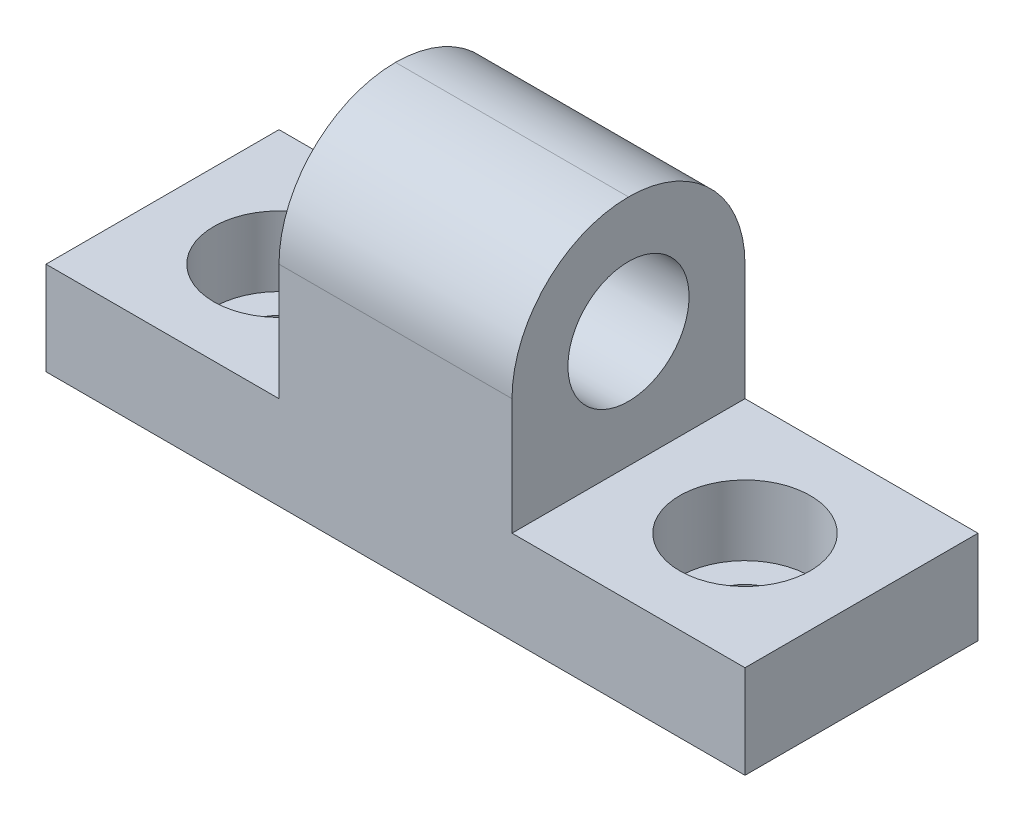
ISO-10303-21;
HEADER;
FILE_DESCRIPTION(('STEP AP214'),'2;1');
FILE_NAME('part.step','',(''),(''),'','','');
FILE_SCHEMA(('AUTOMOTIVE_DESIGN { 1 0 10303 214 1 1 1 1 }'));
ENDSEC;
DATA;
#1=APPLICATION_CONTEXT('core data for automotive mechanical design processes');
#2=APPLICATION_PROTOCOL_DEFINITION('international standard','automotive_design',2000,#1);
#3=PRODUCT_CONTEXT('',#1,'mechanical');
#4=PRODUCT('Part','Part','',(#3));
#5=PRODUCT_RELATED_PRODUCT_CATEGORY('part','',(#4));
#6=PRODUCT_DEFINITION_FORMATION('','',#4);
#7=PRODUCT_DEFINITION_CONTEXT('part definition',#1,'design');
#8=PRODUCT_DEFINITION('design','',#6,#7);
#9=PRODUCT_DEFINITION_SHAPE('','',#8);
#10=(LENGTH_UNIT() NAMED_UNIT(*) SI_UNIT(.MILLI.,.METRE.));
#11=(NAMED_UNIT(*) PLANE_ANGLE_UNIT() SI_UNIT($,.RADIAN.));
#12=(NAMED_UNIT(*) SI_UNIT($,.STERADIAN.) SOLID_ANGLE_UNIT());
#13=UNCERTAINTY_MEASURE_WITH_UNIT(LENGTH_MEASURE(1.E-05),#10,'distance_accuracy_value','');
#14=(GEOMETRIC_REPRESENTATION_CONTEXT(3) GLOBAL_UNCERTAINTY_ASSIGNED_CONTEXT((#13)) GLOBAL_UNIT_ASSIGNED_CONTEXT((#10,
#11,#12)) REPRESENTATION_CONTEXT('',''));
#15=CARTESIAN_POINT('',(0.,0.,0.));
#16=DIRECTION('',(0.,0.,1.));
#17=DIRECTION('',(1.,0.,0.));
#18=AXIS2_PLACEMENT_3D('',#15,#16,#17);
#19=CARTESIAN_POINT('',(0.,4.,0.));
#20=DIRECTION('',(0.,-1.,0.));
#21=DIRECTION('',(0.,0.,-1.));
#22=AXIS2_PLACEMENT_3D('',#19,#20,#21);
#23=PLANE('',#22);
#24=CARTESIAN_POINT('',(5.,4.,-5.));
#25=DIRECTION('',(0.,1.,0.));
#26=DIRECTION('',(0.,0.,1.));
#27=AXIS2_PLACEMENT_3D('',#24,#25,#26);
#28=CIRCLE('',#27,2.8);
#29=CARTESIAN_POINT('',(5.,4.,-2.2));
#30=VERTEX_POINT('',#29);
#31=EDGE_CURVE('E142',#30,#30,#28,.T.);
#32=ORIENTED_EDGE('',*,*,#31,.F.);
#33=EDGE_LOOP('',(#32));
#34=FACE_BOUND('',#33,.T.);
#35=DIRECTION('',(0.,0.,1.));
#36=VECTOR('',#35,1.);
#37=CARTESIAN_POINT('',(10.,4.,0.));
#38=LINE('',#37,#36);
#39=CARTESIAN_POINT('',(10.,4.,-10.));
#40=VERTEX_POINT('',#39);
#41=CARTESIAN_POINT('',(10.,4.,0.));
#42=VERTEX_POINT('',#41);
#43=EDGE_CURVE('E126',#40,#42,#38,.T.);
#44=ORIENTED_EDGE('',*,*,#43,.F.);
#45=DIRECTION('',(-1.,0.,0.));
#46=VECTOR('',#45,1.);
#47=CARTESIAN_POINT('',(0.,4.,-10.));
#48=LINE('',#47,#46);
#49=CARTESIAN_POINT('',(0.,4.,-10.));
#50=VERTEX_POINT('',#49);
#51=EDGE_CURVE('E122',#40,#50,#48,.T.);
#52=ORIENTED_EDGE('',*,*,#51,.T.);
#53=DIRECTION('',(0.,0.,1.));
#54=VECTOR('',#53,1.);
#55=CARTESIAN_POINT('',(0.,4.,0.));
#56=LINE('',#55,#54);
#57=CARTESIAN_POINT('',(0.,4.,0.));
#58=VERTEX_POINT('',#57);
#59=EDGE_CURVE('E158',#50,#58,#56,.T.);
#60=ORIENTED_EDGE('',*,*,#59,.T.);
#61=DIRECTION('',(1.,0.,0.));
#62=VECTOR('',#61,1.);
#63=CARTESIAN_POINT('',(0.,4.,0.));
#64=LINE('',#63,#62);
#65=EDGE_CURVE('E163',#58,#42,#64,.T.);
#66=ORIENTED_EDGE('',*,*,#65,.T.);
#67=EDGE_LOOP('',(#44,#52,#60,#66));
#68=FACE_BOUND('',#67,.T.);
#69=ADVANCED_FACE('F33',(#34,#68),#23,.F.);
#70=CARTESIAN_POINT('',(25.,4.,-5.));
#71=DIRECTION('',(0.,1.,0.));
#72=DIRECTION('',(0.,0.,1.));
#73=AXIS2_PLACEMENT_3D('',#70,#71,#72);
#74=CIRCLE('',#73,2.8);
#75=CARTESIAN_POINT('',(25.,4.,-2.2));
#76=VERTEX_POINT('',#75);
#77=EDGE_CURVE('E137',#76,#76,#74,.T.);
#78=ORIENTED_EDGE('',*,*,#77,.F.);
#79=EDGE_LOOP('',(#78));
#80=FACE_BOUND('',#79,.T.);
#81=DIRECTION('',(0.,0.,-1.));
#82=VECTOR('',#81,1.);
#83=CARTESIAN_POINT('',(20.,4.,0.));
#84=LINE('',#83,#82);
#85=CARTESIAN_POINT('',(20.,4.,0.));
#86=VERTEX_POINT('',#85);
#87=CARTESIAN_POINT('',(20.,4.,-10.));
#88=VERTEX_POINT('',#87);
#89=EDGE_CURVE('E116',#86,#88,#84,.T.);
#90=ORIENTED_EDGE('',*,*,#89,.F.);
#91=CARTESIAN_POINT('',(30.,4.,0.));
#92=VERTEX_POINT('',#91);
#93=EDGE_CURVE('E161',#86,#92,#64,.T.);
#94=ORIENTED_EDGE('',*,*,#93,.T.);
#95=DIRECTION('',(0.,0.,-1.));
#96=VECTOR('',#95,1.);
#97=CARTESIAN_POINT('',(30.,4.,0.));
#98=LINE('',#97,#96);
#99=CARTESIAN_POINT('',(30.,4.,-10.));
#100=VERTEX_POINT('',#99);
#101=EDGE_CURVE('E119',#92,#100,#98,.T.);
#102=ORIENTED_EDGE('',*,*,#101,.T.);
#103=EDGE_CURVE('E105',#100,#88,#48,.T.);
#104=ORIENTED_EDGE('',*,*,#103,.T.);
#105=EDGE_LOOP('',(#90,#94,#102,#104));
#106=FACE_BOUND('',#105,.T.);
#107=ADVANCED_FACE('F115',(#80,#106),#23,.F.);
#108=CARTESIAN_POINT('',(5.,4.,-5.));
#109=DIRECTION('',(0.,-1.,0.));
#110=DIRECTION('',(0.,0.,-1.));
#111=AXIS2_PLACEMENT_3D('',#108,#109,#110);
#112=CYLINDRICAL_SURFACE('',#111,1.55);
#113=CARTESIAN_POINT('',(5.,0.,-5.));
#114=DIRECTION('',(0.,1.,0.));
#115=DIRECTION('',(0.,0.,1.));
#116=AXIS2_PLACEMENT_3D('',#113,#114,#115);
#117=CIRCLE('',#116,1.55);
#118=CARTESIAN_POINT('',(5.,0.,-3.45));
#119=VERTEX_POINT('',#118);
#120=EDGE_CURVE('E153',#119,#119,#117,.T.);
#121=ORIENTED_EDGE('',*,*,#120,.F.);
#122=EDGE_LOOP('',(#121));
#123=FACE_BOUND('',#122,.T.);
#124=CARTESIAN_POINT('',(5.,1.,-5.));
#125=DIRECTION('',(0.,1.,0.));
#126=DIRECTION('',(0.,0.,1.));
#127=AXIS2_PLACEMENT_3D('',#124,#125,#126);
#128=CIRCLE('',#127,1.55);
#129=CARTESIAN_POINT('',(5.,1.,-3.45));
#130=VERTEX_POINT('',#129);
#131=EDGE_CURVE('E154',#130,#130,#128,.T.);
#132=ORIENTED_EDGE('',*,*,#131,.T.);
#133=EDGE_LOOP('',(#132));
#134=FACE_BOUND('',#133,.T.);
#135=ADVANCED_FACE('F227',(#123,#134),#112,.F.);
#136=CARTESIAN_POINT('',(25.,4.,-5.));
#137=DIRECTION('',(0.,-1.,0.));
#138=DIRECTION('',(0.,0.,-1.));
#139=AXIS2_PLACEMENT_3D('',#136,#137,#138);
#140=CYLINDRICAL_SURFACE('',#139,1.55);
#141=CARTESIAN_POINT('',(25.,0.,-5.));
#142=DIRECTION('',(0.,1.,0.));
#143=DIRECTION('',(0.,0.,1.));
#144=AXIS2_PLACEMENT_3D('',#141,#142,#143);
#145=CIRCLE('',#144,1.55);
#146=CARTESIAN_POINT('',(25.,0.,-3.45));
#147=VERTEX_POINT('',#146);
#148=EDGE_CURVE('E150',#147,#147,#145,.T.);
#149=ORIENTED_EDGE('',*,*,#148,.F.);
#150=EDGE_LOOP('',(#149));
#151=FACE_BOUND('',#150,.T.);
#152=CARTESIAN_POINT('',(25.,1.,-5.));
#153=DIRECTION('',(0.,1.,0.));
#154=DIRECTION('',(0.,0.,1.));
#155=AXIS2_PLACEMENT_3D('',#152,#153,#154);
#156=CIRCLE('',#155,1.55);
#157=CARTESIAN_POINT('',(25.,1.,-3.45));
#158=VERTEX_POINT('',#157);
#159=EDGE_CURVE('E141',#158,#158,#156,.T.);
#160=ORIENTED_EDGE('',*,*,#159,.T.);
#161=EDGE_LOOP('',(#160));
#162=FACE_BOUND('',#161,.T.);
#163=ADVANCED_FACE('F220',(#151,#162),#140,.F.);
#164=CARTESIAN_POINT('',(0.,0.,0.));
#165=DIRECTION('',(0.,-1.,0.));
#166=DIRECTION('',(0.,0.,-1.));
#167=AXIS2_PLACEMENT_3D('',#164,#165,#166);
#168=PLANE('',#167);
#169=ORIENTED_EDGE('',*,*,#120,.T.);
#170=EDGE_LOOP('',(#169));
#171=FACE_BOUND('',#170,.T.);
#172=DIRECTION('',(0.,0.,1.));
#173=VECTOR('',#172,1.);
#174=CARTESIAN_POINT('',(0.,0.,0.));
#175=LINE('',#174,#173);
#176=CARTESIAN_POINT('',(0.,0.,-10.));
#177=VERTEX_POINT('',#176);
#178=CARTESIAN_POINT('',(0.,0.,0.));
#179=VERTEX_POINT('',#178);
#180=EDGE_CURVE('E157',#177,#179,#175,.T.);
#181=ORIENTED_EDGE('',*,*,#180,.F.);
#182=DIRECTION('',(-1.,0.,0.));
#183=VECTOR('',#182,1.);
#184=CARTESIAN_POINT('',(0.,0.,-10.));
#185=LINE('',#184,#183);
#186=CARTESIAN_POINT('',(30.,0.,-10.));
#187=VERTEX_POINT('',#186);
#188=EDGE_CURVE('E162',#187,#177,#185,.T.);
#189=ORIENTED_EDGE('',*,*,#188,.F.);
#190=DIRECTION('',(0.,0.,-1.));
#191=VECTOR('',#190,1.);
#192=CARTESIAN_POINT('',(30.,0.,0.));
#193=LINE('',#192,#191);
#194=CARTESIAN_POINT('',(30.,0.,0.));
#195=VERTEX_POINT('',#194);
#196=EDGE_CURVE('E171',#195,#187,#193,.T.);
#197=ORIENTED_EDGE('',*,*,#196,.F.);
#198=DIRECTION('',(1.,0.,0.));
#199=VECTOR('',#198,1.);
#200=CARTESIAN_POINT('',(0.,0.,0.));
#201=LINE('',#200,#199);
#202=EDGE_CURVE('E169',#179,#195,#201,.T.);
#203=ORIENTED_EDGE('',*,*,#202,.F.);
#204=EDGE_LOOP('',(#181,#189,#197,#203));
#205=FACE_BOUND('',#204,.T.);
#206=ORIENTED_EDGE('',*,*,#148,.T.);
#207=EDGE_LOOP('',(#206));
#208=FACE_BOUND('',#207,.T.);
#209=ADVANCED_FACE('F217',(#171,#205,#208),#168,.T.);
#210=CARTESIAN_POINT('',(0.,4.,0.));
#211=DIRECTION('',(1.,0.,0.));
#212=DIRECTION('',(0.,0.,-1.));
#213=AXIS2_PLACEMENT_3D('',#210,#211,#212);
#214=PLANE('',#213);
#215=ORIENTED_EDGE('',*,*,#180,.T.);
#216=DIRECTION('',(0.,-1.,0.));
#217=VECTOR('',#216,1.);
#218=CARTESIAN_POINT('',(0.,4.,0.));
#219=LINE('',#218,#217);
#220=EDGE_CURVE('E181',#58,#179,#219,.T.);
#221=ORIENTED_EDGE('',*,*,#220,.F.);
#222=ORIENTED_EDGE('',*,*,#59,.F.);
#223=DIRECTION('',(0.,-1.,0.));
#224=VECTOR('',#223,1.);
#225=CARTESIAN_POINT('',(0.,4.,-10.));
#226=LINE('',#225,#224);
#227=EDGE_CURVE('E121',#50,#177,#226,.T.);
#228=ORIENTED_EDGE('',*,*,#227,.T.);
#229=EDGE_LOOP('',(#215,#221,#222,#228));
#230=FACE_BOUND('',#229,.T.);
#231=ADVANCED_FACE('F211',(#230),#214,.F.);
#232=CARTESIAN_POINT('',(0.,4.,0.));
#233=DIRECTION('',(0.,0.,-1.));
#234=DIRECTION('',(-1.,0.,0.));
#235=AXIS2_PLACEMENT_3D('',#232,#233,#234);
#236=PLANE('',#235);
#237=DIRECTION('',(0.,-1.,0.));
#238=VECTOR('',#237,1.);
#239=CARTESIAN_POINT('',(20.,14.,0.));
#240=LINE('',#239,#238);
#241=CARTESIAN_POINT('',(20.,9.,0.));
#242=VERTEX_POINT('',#241);
#243=EDGE_CURVE('E110',#242,#86,#240,.T.);
#244=ORIENTED_EDGE('',*,*,#243,.F.);
#245=DIRECTION('',(1.,0.,0.));
#246=VECTOR('',#245,1.);
#247=CARTESIAN_POINT('',(0.,9.,0.));
#248=LINE('',#247,#246);
#249=CARTESIAN_POINT('',(10.,9.,0.));
#250=VERTEX_POINT('',#249);
#251=EDGE_CURVE('E192',#242,#250,#248,.F.);
#252=ORIENTED_EDGE('',*,*,#251,.T.);
#253=DIRECTION('',(0.,-1.,0.));
#254=VECTOR('',#253,1.);
#255=CARTESIAN_POINT('',(10.,14.,0.));
#256=LINE('',#255,#254);
#257=EDGE_CURVE('E135',#250,#42,#256,.T.);
#258=ORIENTED_EDGE('',*,*,#257,.T.);
#259=ORIENTED_EDGE('',*,*,#65,.F.);
#260=ORIENTED_EDGE('',*,*,#220,.T.);
#261=ORIENTED_EDGE('',*,*,#202,.T.);
#262=DIRECTION('',(0.,-1.,0.));
#263=VECTOR('',#262,1.);
#264=CARTESIAN_POINT('',(30.,4.,0.));
#265=LINE('',#264,#263);
#266=EDGE_CURVE('E178',#92,#195,#265,.T.);
#267=ORIENTED_EDGE('',*,*,#266,.F.);
#268=ORIENTED_EDGE('',*,*,#93,.F.);
#269=EDGE_LOOP('',(#244,#252,#258,#259,#260,#261,#267,#268));
#270=FACE_BOUND('',#269,.T.);
#271=ADVANCED_FACE('F198',(#270),#236,.F.);
#272=CARTESIAN_POINT('',(30.,4.,0.));
#273=DIRECTION('',(-1.,0.,0.));
#274=DIRECTION('',(0.,0.,1.));
#275=AXIS2_PLACEMENT_3D('',#272,#273,#274);
#276=PLANE('',#275);
#277=ORIENTED_EDGE('',*,*,#196,.T.);
#278=DIRECTION('',(0.,-1.,0.));
#279=VECTOR('',#278,1.);
#280=CARTESIAN_POINT('',(30.,4.,-10.));
#281=LINE('',#280,#279);
#282=EDGE_CURVE('E176',#100,#187,#281,.T.);
#283=ORIENTED_EDGE('',*,*,#282,.F.);
#284=ORIENTED_EDGE('',*,*,#101,.F.);
#285=ORIENTED_EDGE('',*,*,#266,.T.);
#286=EDGE_LOOP('',(#277,#283,#284,#285));
#287=FACE_BOUND('',#286,.T.);
#288=ADVANCED_FACE('F216',(#287),#276,.F.);
#289=CARTESIAN_POINT('',(0.,4.,-10.));
#290=DIRECTION('',(0.,0.,1.));
#291=DIRECTION('',(1.,0.,0.));
#292=AXIS2_PLACEMENT_3D('',#289,#290,#291);
#293=PLANE('',#292);
#294=DIRECTION('',(0.,-1.,0.));
#295=VECTOR('',#294,1.);
#296=CARTESIAN_POINT('',(10.,14.,-10.));
#297=LINE('',#296,#295);
#298=CARTESIAN_POINT('',(10.,9.,-10.));
#299=VERTEX_POINT('',#298);
#300=EDGE_CURVE('E111',#299,#40,#297,.T.);
#301=ORIENTED_EDGE('',*,*,#300,.F.);
#302=DIRECTION('',(-1.,0.,0.));
#303=VECTOR('',#302,1.);
#304=CARTESIAN_POINT('',(0.,9.,-10.));
#305=LINE('',#304,#303);
#306=CARTESIAN_POINT('',(20.,9.,-10.));
#307=VERTEX_POINT('',#306);
#308=EDGE_CURVE('E11',#299,#307,#305,.F.);
#309=ORIENTED_EDGE('',*,*,#308,.T.);
#310=DIRECTION('',(0.,-1.,0.));
#311=VECTOR('',#310,1.);
#312=CARTESIAN_POINT('',(20.,14.,-10.));
#313=LINE('',#312,#311);
#314=EDGE_CURVE('E101',#307,#88,#313,.T.);
#315=ORIENTED_EDGE('',*,*,#314,.T.);
#316=ORIENTED_EDGE('',*,*,#103,.F.);
#317=ORIENTED_EDGE('',*,*,#282,.T.);
#318=ORIENTED_EDGE('',*,*,#188,.T.);
#319=ORIENTED_EDGE('',*,*,#227,.F.);
#320=ORIENTED_EDGE('',*,*,#51,.F.);
#321=EDGE_LOOP('',(#301,#309,#315,#316,#317,#318,#319,#320));
#322=FACE_BOUND('',#321,.T.);
#323=ADVANCED_FACE('F103',(#322),#293,.F.);
#324=CARTESIAN_POINT('',(25.,1.,-5.));
#325=DIRECTION('',(0.,1.,0.));
#326=DIRECTION('',(0.,0.,1.));
#327=AXIS2_PLACEMENT_3D('',#324,#325,#326);
#328=CYLINDRICAL_SURFACE('',#327,2.8);
#329=CARTESIAN_POINT('',(25.,1.,-5.));
#330=DIRECTION('',(0.,1.,0.));
#331=DIRECTION('',(0.,0.,1.));
#332=AXIS2_PLACEMENT_3D('',#329,#330,#331);
#333=CIRCLE('',#332,2.8);
#334=CARTESIAN_POINT('',(25.,1.,-2.2));
#335=VERTEX_POINT('',#334);
#336=EDGE_CURVE('E145',#335,#335,#333,.T.);
#337=ORIENTED_EDGE('',*,*,#336,.F.);
#338=EDGE_LOOP('',(#337));
#339=FACE_BOUND('',#338,.T.);
#340=ORIENTED_EDGE('',*,*,#77,.T.);
#341=EDGE_LOOP('',(#340));
#342=FACE_BOUND('',#341,.T.);
#343=ADVANCED_FACE('F235',(#339,#342),#328,.F.);
#344=CARTESIAN_POINT('',(25.,1.,-5.));
#345=DIRECTION('',(0.,1.,0.));
#346=DIRECTION('',(0.,0.,1.));
#347=AXIS2_PLACEMENT_3D('',#344,#345,#346);
#348=PLANE('',#347);
#349=ORIENTED_EDGE('',*,*,#159,.F.);
#350=EDGE_LOOP('',(#349));
#351=FACE_BOUND('',#350,.T.);
#352=ORIENTED_EDGE('',*,*,#336,.T.);
#353=EDGE_LOOP('',(#352));
#354=FACE_BOUND('',#353,.T.);
#355=ADVANCED_FACE('F231',(#351,#354),#348,.T.);
#356=CARTESIAN_POINT('',(5.,1.,-5.));
#357=DIRECTION('',(0.,1.,0.));
#358=DIRECTION('',(0.,0.,1.));
#359=AXIS2_PLACEMENT_3D('',#356,#357,#358);
#360=CYLINDRICAL_SURFACE('',#359,2.8);
#361=CARTESIAN_POINT('',(5.,1.,-5.));
#362=DIRECTION('',(0.,1.,0.));
#363=DIRECTION('',(0.,0.,1.));
#364=AXIS2_PLACEMENT_3D('',#361,#362,#363);
#365=CIRCLE('',#364,2.8);
#366=CARTESIAN_POINT('',(5.,1.,-2.2));
#367=VERTEX_POINT('',#366);
#368=EDGE_CURVE('E138',#367,#367,#365,.T.);
#369=ORIENTED_EDGE('',*,*,#368,.F.);
#370=EDGE_LOOP('',(#369));
#371=FACE_BOUND('',#370,.T.);
#372=ORIENTED_EDGE('',*,*,#31,.T.);
#373=EDGE_LOOP('',(#372));
#374=FACE_BOUND('',#373,.T.);
#375=ADVANCED_FACE('F234',(#371,#374),#360,.F.);
#376=CARTESIAN_POINT('',(5.,1.,-5.));
#377=DIRECTION('',(0.,1.,0.));
#378=DIRECTION('',(0.,0.,1.));
#379=AXIS2_PLACEMENT_3D('',#376,#377,#378);
#380=PLANE('',#379);
#381=ORIENTED_EDGE('',*,*,#131,.F.);
#382=EDGE_LOOP('',(#381));
#383=FACE_BOUND('',#382,.T.);
#384=ORIENTED_EDGE('',*,*,#368,.T.);
#385=EDGE_LOOP('',(#384));
#386=FACE_BOUND('',#385,.T.);
#387=ADVANCED_FACE('F288',(#383,#386),#380,.T.);
#388=CARTESIAN_POINT('',(10.,14.,0.));
#389=DIRECTION('',(1.,0.,0.));
#390=DIRECTION('',(0.,0.,-1.));
#391=AXIS2_PLACEMENT_3D('',#388,#389,#390);
#392=PLANE('',#391);
#393=CARTESIAN_POINT('',(10.,9.,-5.));
#394=DIRECTION('',(-1.,0.,0.));
#395=DIRECTION('',(0.,0.,1.));
#396=AXIS2_PLACEMENT_3D('',#393,#394,#395);
#397=CIRCLE('',#396,2.6);
#398=CARTESIAN_POINT('',(10.,9.,-2.4));
#399=VERTEX_POINT('',#398);
#400=EDGE_CURVE('E270',#399,#399,#397,.T.);
#401=ORIENTED_EDGE('',*,*,#400,.F.);
#402=EDGE_LOOP('',(#401));
#403=FACE_BOUND('',#402,.T.);
#404=ORIENTED_EDGE('',*,*,#257,.F.);
#405=CARTESIAN_POINT('',(10.,9.,-5.));
#406=DIRECTION('',(1.,0.,0.));
#407=DIRECTION('',(0.,0.,-1.));
#408=AXIS2_PLACEMENT_3D('',#405,#406,#407);
#409=CIRCLE('',#408,5.);
#410=CARTESIAN_POINT('',(10.,14.,-5.));
#411=VERTEX_POINT('',#410);
#412=EDGE_CURVE('E42',#250,#411,#409,.F.);
#413=ORIENTED_EDGE('',*,*,#412,.T.);
#414=CARTESIAN_POINT('',(10.,9.,-5.));
#415=DIRECTION('',(1.,0.,0.));
#416=DIRECTION('',(0.,0.,-1.));
#417=AXIS2_PLACEMENT_3D('',#414,#415,#416);
#418=CIRCLE('',#417,5.);
#419=EDGE_CURVE('E49',#411,#299,#418,.F.);
#420=ORIENTED_EDGE('',*,*,#419,.T.);
#421=ORIENTED_EDGE('',*,*,#300,.T.);
#422=ORIENTED_EDGE('',*,*,#43,.T.);
#423=EDGE_LOOP('',(#404,#413,#420,#421,#422));
#424=FACE_BOUND('',#423,.T.);
#425=ADVANCED_FACE('F201',(#403,#424),#392,.F.);
#426=CARTESIAN_POINT('',(20.,14.,0.));
#427=DIRECTION('',(-1.,0.,0.));
#428=DIRECTION('',(0.,0.,1.));
#429=AXIS2_PLACEMENT_3D('',#426,#427,#428);
#430=PLANE('',#429);
#431=CARTESIAN_POINT('',(20.,9.,-5.));
#432=DIRECTION('',(-1.,0.,0.));
#433=DIRECTION('',(0.,0.,1.));
#434=AXIS2_PLACEMENT_3D('',#431,#432,#433);
#435=CIRCLE('',#434,2.6);
#436=CARTESIAN_POINT('',(20.,9.,-2.4));
#437=VERTEX_POINT('',#436);
#438=EDGE_CURVE('E130',#437,#437,#435,.T.);
#439=ORIENTED_EDGE('',*,*,#438,.T.);
#440=EDGE_LOOP('',(#439));
#441=FACE_BOUND('',#440,.T.);
#442=CARTESIAN_POINT('',(20.,9.,-5.));
#443=DIRECTION('',(-1.,0.,0.));
#444=DIRECTION('',(0.,0.,1.));
#445=AXIS2_PLACEMENT_3D('',#442,#443,#444);
#446=CIRCLE('',#445,5.);
#447=CARTESIAN_POINT('',(20.,14.,-5.));
#448=VERTEX_POINT('',#447);
#449=EDGE_CURVE('E184',#307,#448,#446,.F.);
#450=ORIENTED_EDGE('',*,*,#449,.T.);
#451=CARTESIAN_POINT('',(20.,9.,-5.));
#452=DIRECTION('',(-1.,0.,0.));
#453=DIRECTION('',(0.,0.,1.));
#454=AXIS2_PLACEMENT_3D('',#451,#452,#453);
#455=CIRCLE('',#454,5.);
#456=EDGE_CURVE('E190',#448,#242,#455,.F.);
#457=ORIENTED_EDGE('',*,*,#456,.T.);
#458=ORIENTED_EDGE('',*,*,#243,.T.);
#459=ORIENTED_EDGE('',*,*,#89,.T.);
#460=ORIENTED_EDGE('',*,*,#314,.F.);
#461=EDGE_LOOP('',(#450,#457,#458,#459,#460));
#462=FACE_BOUND('',#461,.T.);
#463=ADVANCED_FACE('F124',(#441,#462),#430,.F.);
#464=CARTESIAN_POINT('',(20.,9.,-5.));
#465=DIRECTION('',(-1.,0.,0.));
#466=DIRECTION('',(0.,0.,1.));
#467=AXIS2_PLACEMENT_3D('',#464,#465,#466);
#468=CYLINDRICAL_SURFACE('',#467,2.6);
#469=ORIENTED_EDGE('',*,*,#438,.F.);
#470=EDGE_LOOP('',(#469));
#471=FACE_BOUND('',#470,.T.);
#472=ORIENTED_EDGE('',*,*,#400,.T.);
#473=EDGE_LOOP('',(#472));
#474=FACE_BOUND('',#473,.T.);
#475=ADVANCED_FACE('F266',(#471,#474),#468,.F.);
#476=CARTESIAN_POINT('',(0.,9.,-5.));
#477=DIRECTION('',(-1.,0.,0.));
#478=DIRECTION('',(0.,0.,1.));
#479=AXIS2_PLACEMENT_3D('',#476,#477,#478);
#480=CYLINDRICAL_SURFACE('',#479,5.);
#481=ORIENTED_EDGE('',*,*,#308,.F.);
#482=ORIENTED_EDGE('',*,*,#419,.F.);
#483=DIRECTION('',(-1.,0.,0.));
#484=VECTOR('',#483,1.);
#485=CARTESIAN_POINT('',(0.,14.,-5.));
#486=LINE('',#485,#484);
#487=EDGE_CURVE('E37',#448,#411,#486,.T.);
#488=ORIENTED_EDGE('',*,*,#487,.F.);
#489=ORIENTED_EDGE('',*,*,#449,.F.);
#490=EDGE_LOOP('',(#481,#482,#488,#489));
#491=FACE_BOUND('',#490,.T.);
#492=ADVANCED_FACE('F35',(#491),#480,.T.);
#493=CARTESIAN_POINT('',(0.,9.,-5.));
#494=DIRECTION('',(1.,0.,0.));
#495=DIRECTION('',(0.,0.,-1.));
#496=AXIS2_PLACEMENT_3D('',#493,#494,#495);
#497=CYLINDRICAL_SURFACE('',#496,5.);
#498=ORIENTED_EDGE('',*,*,#412,.F.);
#499=ORIENTED_EDGE('',*,*,#251,.F.);
#500=ORIENTED_EDGE('',*,*,#456,.F.);
#501=ORIENTED_EDGE('',*,*,#487,.T.);
#502=EDGE_LOOP('',(#498,#499,#500,#501));
#503=FACE_BOUND('',#502,.T.);
#504=ADVANCED_FACE('F261',(#503),#497,.T.);
#505=CLOSED_SHELL('',(#69,#107,#135,#163,#209,#231,#271,#288,#323,#343,#355,#375,#387,#425,#463,
#475,#492,#504));
#506=MANIFOLD_SOLID_BREP('B2',#505);
#507=ADVANCED_BREP_SHAPE_REPRESENTATION('',(#18,#506),#14);
#508=SHAPE_DEFINITION_REPRESENTATION(#9,#507);
ENDSEC;
END-ISO-10303-21;
